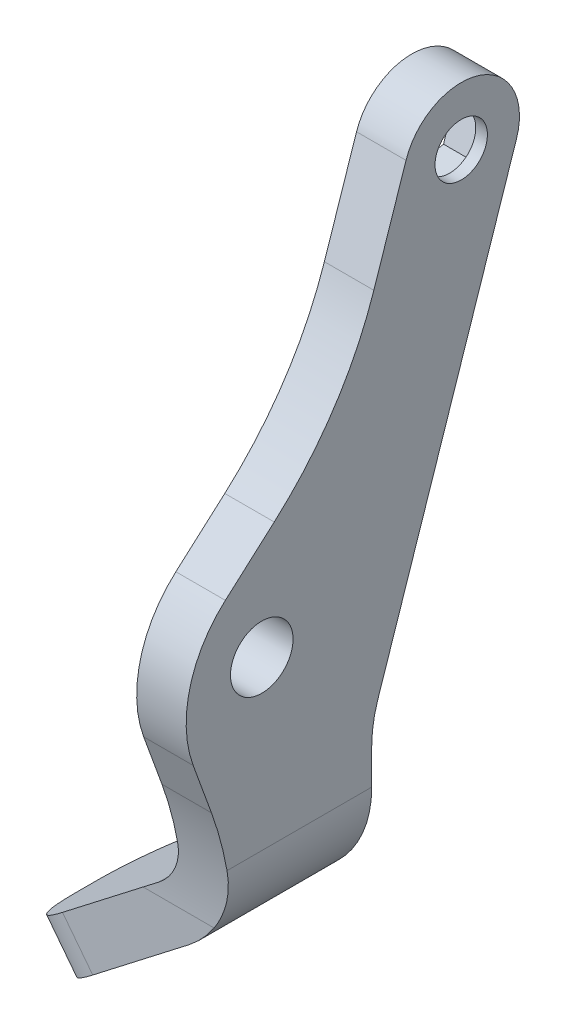
ISO-10303-21;
HEADER;
FILE_DESCRIPTION(('STEP AP214'),'2;1');
FILE_NAME('part.step','',(''),(''),'','','');
FILE_SCHEMA(('AUTOMOTIVE_DESIGN { 1 0 10303 214 1 1 1 1 }'));
ENDSEC;
DATA;
#1=APPLICATION_CONTEXT('core data for automotive mechanical design processes');
#2=APPLICATION_PROTOCOL_DEFINITION('international standard','automotive_design',2000,#1);
#3=PRODUCT_CONTEXT('',#1,'mechanical');
#4=PRODUCT('Part','Part','',(#3));
#5=PRODUCT_RELATED_PRODUCT_CATEGORY('part','',(#4));
#6=PRODUCT_DEFINITION_FORMATION('','',#4);
#7=PRODUCT_DEFINITION_CONTEXT('part definition',#1,'design');
#8=PRODUCT_DEFINITION('design','',#6,#7);
#9=PRODUCT_DEFINITION_SHAPE('','',#8);
#10=(LENGTH_UNIT() NAMED_UNIT(*) SI_UNIT(.MILLI.,.METRE.));
#11=(NAMED_UNIT(*) PLANE_ANGLE_UNIT() SI_UNIT($,.RADIAN.));
#12=(NAMED_UNIT(*) SI_UNIT($,.STERADIAN.) SOLID_ANGLE_UNIT());
#13=UNCERTAINTY_MEASURE_WITH_UNIT(LENGTH_MEASURE(1.E-05),#10,'distance_accuracy_value','');
#14=(GEOMETRIC_REPRESENTATION_CONTEXT(3) GLOBAL_UNCERTAINTY_ASSIGNED_CONTEXT((#13)) GLOBAL_UNIT_ASSIGNED_CONTEXT((#10,
#11,#12)) REPRESENTATION_CONTEXT('',''));
#15=CARTESIAN_POINT('',(0.,0.,0.));
#16=DIRECTION('',(0.,0.,1.));
#17=DIRECTION('',(1.,0.,0.));
#18=AXIS2_PLACEMENT_3D('',#15,#16,#17);
#19=CARTESIAN_POINT('',(15.8,-64.4,-62.432996066738));
#20=DIRECTION('',(0.,0.,1.));
#21=DIRECTION('',(1.,0.,0.));
#22=AXIS2_PLACEMENT_3D('',#19,#20,#21);
#23=PLANE('',#22);
#24=CARTESIAN_POINT('',(33.1,-64.3999999999998,-62.432996066738));
#25=DIRECTION('',(0.,0.,1.));
#26=DIRECTION('',(1.,0.,0.));
#27=AXIS2_PLACEMENT_3D('',#24,#25,#26);
#28=CIRCLE('',#27,7.7);
#29=CARTESIAN_POINT('',(37.8083729395756,-70.4927189547746,-62.432996066738));
#30=VERTEX_POINT('',#29);
#31=CARTESIAN_POINT('',(39.5328427948738,-68.6318475370031,-62.432996066738));
#32=VERTEX_POINT('',#31);
#33=EDGE_CURVE('E703',#30,#32,#28,.T.);
#34=ORIENTED_EDGE('',*,*,#33,.T.);
#35=DIRECTION('',(1.,0.,0.));
#36=VECTOR('',#35,1.);
#37=CARTESIAN_POINT('',(37.4,-68.6318475370031,-62.432996066738));
#38=LINE('',#37,#36);
#39=CARTESIAN_POINT('',(34.6560666904699,-68.6318475370031,-62.432996066738));
#40=VERTEX_POINT('',#39);
#41=EDGE_CURVE('E594',#32,#40,#38,.F.);
#42=ORIENTED_EDGE('',*,*,#41,.T.);
#43=DIRECTION('',(0.791262201918808,0.611477005139686,0.));
#44=VECTOR('',#43,1.);
#45=CARTESIAN_POINT('',(25.9538295509274,-75.3568217506062,-62.432996066738));
#46=LINE('',#45,#44);
#47=CARTESIAN_POINT('',(29.1188783586026,-72.9109137300475,-62.432996066738));
#48=VERTEX_POINT('',#47);
#49=EDGE_CURVE('E305',#48,#40,#46,.T.);
#50=ORIENTED_EDGE('',*,*,#49,.F.);
#51=DIRECTION('',(-0.611477005139684,0.79126220191881,0.));
#52=VECTOR('',#51,1.);
#53=CARTESIAN_POINT('',(31.1979001760775,-75.6012052165714,-62.432996066738));
#54=LINE('',#53,#52);
#55=CARTESIAN_POINT('',(31.1979001760775,-75.6012052165714,-62.432996066738));
#56=VERTEX_POINT('',#55);
#57=EDGE_CURVE('E677',#48,#56,#54,.F.);
#58=ORIENTED_EDGE('',*,*,#57,.T.);
#59=DIRECTION('',(-0.791262201918808,-0.611477005139686,0.));
#60=VECTOR('',#59,1.);
#61=CARTESIAN_POINT('',(37.8083729395754,-70.4927189547748,-62.432996066738));
#62=LINE('',#61,#60);
#63=EDGE_CURVE('E310',#30,#56,#62,.T.);
#64=ORIENTED_EDGE('',*,*,#63,.F.);
#65=EDGE_LOOP('',(#34,#42,#50,#58,#64));
#66=FACE_BOUND('',#65,.T.);
#67=ADVANCED_FACE('F51',(#66),#23,.T.);
#68=CARTESIAN_POINT('',(37.8083729395754,-70.4927189547748,-67.216498033369));
#69=DIRECTION('',(0.611477005139686,-0.791262201918808,0.));
#70=DIRECTION('',(0.,0.,-1.));
#71=AXIS2_PLACEMENT_3D('',#68,#69,#70);
#72=PLANE('',#71);
#73=DIRECTION('',(-0.791262201918808,-0.611477005139686,0.));
#74=VECTOR('',#73,1.);
#75=CARTESIAN_POINT('',(37.8083729395754,-70.4927189547748,-72.));
#76=LINE('',#75,#74);
#77=CARTESIAN_POINT('',(37.8083729395756,-70.4927189547746,-72.));
#78=VERTEX_POINT('',#77);
#79=CARTESIAN_POINT('',(31.1979001760775,-75.6012052165714,-72.));
#80=VERTEX_POINT('',#79);
#81=EDGE_CURVE('E343',#78,#80,#76,.T.);
#82=ORIENTED_EDGE('',*,*,#81,.F.);
#83=DIRECTION('',(0.,0.,1.));
#84=VECTOR('',#83,1.);
#85=CARTESIAN_POINT('',(37.8083729395756,-70.4927189547746,-67.216498033369));
#86=LINE('',#85,#84);
#87=EDGE_CURVE('E699',#78,#30,#86,.T.);
#88=ORIENTED_EDGE('',*,*,#87,.T.);
#89=ORIENTED_EDGE('',*,*,#63,.T.);
#90=CARTESIAN_POINT('',(31.1979001760775,-75.6012052165714,-66.432996066738));
#91=DIRECTION('',(0.611477005139686,-0.791262201918808,0.));
#92=DIRECTION('',(0.791262201918808,0.611477005139686,0.));
#93=AXIS2_PLACEMENT_3D('',#90,#91,#92);
#94=CIRCLE('',#93,4.);
#95=CARTESIAN_POINT('',(28.0328513684023,-78.0471132371301,-66.432996066738));
#96=VERTEX_POINT('',#95);
#97=EDGE_CURVE('E688',#56,#96,#94,.T.);
#98=ORIENTED_EDGE('',*,*,#97,.T.);
#99=DIRECTION('',(0.,0.,1.));
#100=VECTOR('',#99,1.);
#101=CARTESIAN_POINT('',(28.0328513684023,-78.0471132371301,-62.432996066738));
#102=LINE('',#101,#100);
#103=CARTESIAN_POINT('',(28.0328513684023,-78.0471132371301,-68.));
#104=VERTEX_POINT('',#103);
#105=EDGE_CURVE('E282',#104,#96,#102,.T.);
#106=ORIENTED_EDGE('',*,*,#105,.F.);
#107=CARTESIAN_POINT('',(31.1979001760775,-75.6012052165714,-68.));
#108=DIRECTION('',(0.611477005139686,-0.791262201918808,0.));
#109=DIRECTION('',(0.791262201918808,0.611477005139686,0.));
#110=AXIS2_PLACEMENT_3D('',#107,#108,#109);
#111=CIRCLE('',#110,4.);
#112=EDGE_CURVE('E684',#104,#80,#111,.T.);
#113=ORIENTED_EDGE('',*,*,#112,.T.);
#114=EDGE_LOOP('',(#82,#88,#89,#98,#106,#113));
#115=FACE_BOUND('',#114,.T.);
#116=ADVANCED_FACE('F639',(#115),#72,.T.);
#117=CARTESIAN_POINT('',(40.802,-64.9734332809365,-72.));
#118=DIRECTION('',(0.,0.,-1.));
#119=DIRECTION('',(0.,-1.,0.));
#120=AXIS2_PLACEMENT_3D('',#117,#118,#119);
#121=PLANE('',#120);
#122=DIRECTION('',(0.,1.,0.));
#123=VECTOR('',#122,1.);
#124=CARTESIAN_POINT('',(37.4,-64.9734332809365,-72.));
#125=LINE('',#124,#123);
#126=CARTESIAN_POINT('',(37.4,-64.3999999999999,-72.));
#127=VERTEX_POINT('',#126);
#128=CARTESIAN_POINT('',(37.4,-61.9468665618731,-72.));
#129=VERTEX_POINT('',#128);
#130=EDGE_CURVE('E309',#127,#129,#125,.T.);
#131=ORIENTED_EDGE('',*,*,#130,.T.);
#132=DIRECTION('',(1.,0.,0.));
#133=VECTOR('',#132,1.);
#134=CARTESIAN_POINT('',(40.8,-61.9468665618731,-72.));
#135=LINE('',#134,#133);
#136=CARTESIAN_POINT('',(40.8,-61.9468665618731,-72.));
#137=VERTEX_POINT('',#136);
#138=EDGE_CURVE('E560',#129,#137,#135,.T.);
#139=ORIENTED_EDGE('',*,*,#138,.T.);
#140=DIRECTION('',(0.,-1.,0.));
#141=VECTOR('',#140,1.);
#142=CARTESIAN_POINT('',(40.8,-64.9734332809365,-72.));
#143=LINE('',#142,#141);
#144=CARTESIAN_POINT('',(40.8,-64.3999999999998,-72.));
#145=VERTEX_POINT('',#144);
#146=EDGE_CURVE('E388',#137,#145,#143,.T.);
#147=ORIENTED_EDGE('',*,*,#146,.T.);
#148=CARTESIAN_POINT('',(33.1,-64.3999999999998,-72.));
#149=DIRECTION('',(0.,0.,-1.));
#150=DIRECTION('',(-1.,0.,0.));
#151=AXIS2_PLACEMENT_3D('',#148,#149,#150);
#152=CIRCLE('',#151,7.7);
#153=EDGE_CURVE('E710',#145,#78,#152,.T.);
#154=ORIENTED_EDGE('',*,*,#153,.T.);
#155=ORIENTED_EDGE('',*,*,#81,.T.);
#156=DIRECTION('',(0.611477005139684,-0.79126220191881,0.));
#157=VECTOR('',#156,1.);
#158=CARTESIAN_POINT('',(29.1188783586026,-72.9109137300475,-72.));
#159=LINE('',#158,#157);
#160=CARTESIAN_POINT('',(29.1188783586026,-72.9109137300475,-72.));
#161=VERTEX_POINT('',#160);
#162=EDGE_CURVE('E666',#80,#161,#159,.F.);
#163=ORIENTED_EDGE('',*,*,#162,.T.);
#164=DIRECTION('',(0.791262201918808,0.611477005139686,0.));
#165=VECTOR('',#164,1.);
#166=CARTESIAN_POINT('',(25.9538295509274,-75.3568217506062,-72.));
#167=LINE('',#166,#165);
#168=CARTESIAN_POINT('',(35.7293511221007,-67.8024274682508,-72.));
#169=VERTEX_POINT('',#168);
#170=EDGE_CURVE('E301',#161,#169,#167,.T.);
#171=ORIENTED_EDGE('',*,*,#170,.T.);
#172=CARTESIAN_POINT('',(33.1,-64.3999999999999,-72.));
#173=DIRECTION('',(0.,0.,-1.));
#174=DIRECTION('',(-1.,0.,0.));
#175=AXIS2_PLACEMENT_3D('',#172,#173,#174);
#176=CIRCLE('',#175,4.3);
#177=EDGE_CURVE('E562',#169,#127,#176,.F.);
#178=ORIENTED_EDGE('',*,*,#177,.T.);
#179=EDGE_LOOP('',(#131,#139,#147,#154,#155,#163,#171,#178));
#180=FACE_BOUND('',#179,.T.);
#181=ADVANCED_FACE('F559',(#180),#121,.T.);
#182=CARTESIAN_POINT('',(40.802,-34.6444235050632,-72.2334658327325));
#183=DIRECTION('',(0.,-0.316156072713349,-0.948707192808441));
#184=DIRECTION('',(0.,-0.948707192808441,0.316156072713349));
#185=AXIS2_PLACEMENT_3D('',#182,#183,#184);
#186=PLANE('',#185);
#187=DIRECTION('',(0.,0.948707192808441,-0.316156072713349));
#188=VECTOR('',#187,1.);
#189=CARTESIAN_POINT('',(37.4,-34.6444235050632,-72.2334658327325));
#190=LINE('',#189,#188);
#191=CARTESIAN_POINT('',(37.4,-34.9076169986524,-72.1457567672509));
#192=VERTEX_POINT('',#191);
#193=CARTESIAN_POINT('',(37.4,-28.2803021834753,-74.3543052429918));
#194=VERTEX_POINT('',#193);
#195=EDGE_CURVE('E488',#192,#194,#190,.T.);
#196=ORIENTED_EDGE('',*,*,#195,.F.);
#197=DIRECTION('',(-1.,0.,0.));
#198=VECTOR('',#197,1.);
#199=CARTESIAN_POINT('',(40.802,-34.9076169986524,-72.1457567672509));
#200=LINE('',#199,#198);
#201=CARTESIAN_POINT('',(40.8,-34.9076169986524,-72.1457567672509));
#202=VERTEX_POINT('',#201);
#203=EDGE_CURVE('E588',#192,#202,#200,.F.);
#204=ORIENTED_EDGE('',*,*,#203,.T.);
#205=DIRECTION('',(0.,-0.948707192808441,0.316156072713349));
#206=VECTOR('',#205,1.);
#207=CARTESIAN_POINT('',(40.8,-34.6444235050632,-72.2334658327325));
#208=LINE('',#207,#206);
#209=CARTESIAN_POINT('',(40.8,-28.2803021834753,-74.3543052429918));
#210=VERTEX_POINT('',#209);
#211=EDGE_CURVE('E407',#210,#202,#208,.T.);
#212=ORIENTED_EDGE('',*,*,#211,.F.);
#213=DIRECTION('',(-1.,0.,0.));
#214=VECTOR('',#213,1.);
#215=CARTESIAN_POINT('',(40.802,-28.2803021834753,-74.3543052429918));
#216=LINE('',#215,#214);
#217=EDGE_CURVE('E315',#210,#194,#216,.T.);
#218=ORIENTED_EDGE('',*,*,#217,.T.);
#219=EDGE_LOOP('',(#196,#204,#212,#218));
#220=FACE_BOUND('',#219,.T.);
#221=ADVANCED_FACE('F775',(#220),#186,.F.);
#222=CARTESIAN_POINT('',(40.802,-29.5449264743287,-78.1491340142255));
#223=DIRECTION('',(-1.,0.,0.));
#224=DIRECTION('',(0.,0.,1.));
#225=AXIS2_PLACEMENT_3D('',#222,#223,#224);
#226=CYLINDRICAL_SURFACE('',#225,4.);
#227=CARTESIAN_POINT('',(37.4,-29.5449264743287,-78.1491340142255));
#228=DIRECTION('',(-1.,0.,0.));
#229=DIRECTION('',(0.,0.,1.));
#230=AXIS2_PLACEMENT_3D('',#227,#228,#229);
#231=CIRCLE('',#230,4.);
#232=CARTESIAN_POINT('',(37.4,-30.8095507651821,-81.9439627854593));
#233=VERTEX_POINT('',#232);
#234=EDGE_CURVE('E484',#194,#233,#231,.T.);
#235=ORIENTED_EDGE('',*,*,#234,.F.);
#236=ORIENTED_EDGE('',*,*,#217,.F.);
#237=CARTESIAN_POINT('',(40.8,-29.5449264743287,-78.1491340142255));
#238=DIRECTION('',(1.,0.,0.));
#239=DIRECTION('',(0.,0.,-1.));
#240=AXIS2_PLACEMENT_3D('',#237,#238,#239);
#241=CIRCLE('',#240,4.);
#242=CARTESIAN_POINT('',(40.8,-30.8095507651821,-81.9439627854593));
#243=VERTEX_POINT('',#242);
#244=EDGE_CURVE('E400',#243,#210,#241,.T.);
#245=ORIENTED_EDGE('',*,*,#244,.F.);
#246=DIRECTION('',(-1.,0.,0.));
#247=VECTOR('',#246,1.);
#248=CARTESIAN_POINT('',(40.802,-30.8095507651821,-81.9439627854593));
#249=LINE('',#248,#247);
#250=EDGE_CURVE('E348',#243,#233,#249,.T.);
#251=ORIENTED_EDGE('',*,*,#250,.T.);
#252=EDGE_LOOP('',(#235,#236,#245,#251));
#253=FACE_BOUND('',#252,.T.);
#254=ADVANCED_FACE('F649',(#253),#226,.T.);
#255=CARTESIAN_POINT('',(40.802,-45.1135843726741,-77.1771526214959));
#256=DIRECTION('',(0.,-0.316156072713349,-0.948707192808441));
#257=DIRECTION('',(0.,-0.948707192808441,0.316156072713349));
#258=AXIS2_PLACEMENT_3D('',#255,#256,#257);
#259=PLANE('',#258);
#260=DIRECTION('',(0.,-0.948707192808441,0.316156072713349));
#261=VECTOR('',#260,1.);
#262=CARTESIAN_POINT('',(40.8,-45.1135843726741,-77.1771526214959));
#263=LINE('',#262,#261);
#264=CARTESIAN_POINT('',(40.8,-59.4176179801664,-72.4103424575325));
#265=VERTEX_POINT('',#264);
#266=EDGE_CURVE('E395',#243,#265,#263,.T.);
#267=ORIENTED_EDGE('',*,*,#266,.T.);
#268=DIRECTION('',(1.,0.,0.));
#269=VECTOR('',#268,1.);
#270=CARTESIAN_POINT('',(37.4,-59.4176179801664,-72.4103424575325));
#271=LINE('',#270,#269);
#272=CARTESIAN_POINT('',(37.4,-59.4176179801663,-72.4103424575325));
#273=VERTEX_POINT('',#272);
#274=EDGE_CURVE('E570',#265,#273,#271,.F.);
#275=ORIENTED_EDGE('',*,*,#274,.T.);
#276=DIRECTION('',(0.,0.94870719280844,-0.31615607271335));
#277=VECTOR('',#276,1.);
#278=CARTESIAN_POINT('',(37.4,-45.1135843726741,-77.1771526214959));
#279=LINE('',#278,#277);
#280=EDGE_CURVE('E352',#273,#233,#279,.T.);
#281=ORIENTED_EDGE('',*,*,#280,.T.);
#282=ORIENTED_EDGE('',*,*,#250,.F.);
#283=EDGE_LOOP('',(#267,#275,#281,#282));
#284=FACE_BOUND('',#283,.T.);
#285=ADVANCED_FACE('F746',(#284),#259,.T.);
#286=CARTESIAN_POINT('',(40.802,-43.2008771904526,-67.6406835772999));
#287=DIRECTION('',(0.,0.7481527869347,0.663526493368457));
#288=DIRECTION('',(1.,0.,0.));
#289=AXIS2_PLACEMENT_3D('',#286,#287,#288);
#290=PLANE('',#289);
#291=DIRECTION('',(0.,0.663526493368457,-0.7481527869347));
#292=VECTOR('',#291,1.);
#293=CARTESIAN_POINT('',(40.8,-43.2008771904526,-67.6406835772999));
#294=LINE('',#293,#292);
#295=CARTESIAN_POINT('',(40.8,-48.2560776774387,-61.9407418708998));
#296=VERTEX_POINT('',#295);
#297=CARTESIAN_POINT('',(40.8,-45.2755381399649,-65.3014199806913));
#298=VERTEX_POINT('',#297);
#299=EDGE_CURVE('E349',#296,#298,#294,.T.);
#300=ORIENTED_EDGE('',*,*,#299,.T.);
#301=DIRECTION('',(-1.,0.,0.));
#302=VECTOR('',#301,1.);
#303=CARTESIAN_POINT('',(40.802,-45.2755381399649,-65.3014199806913));
#304=LINE('',#303,#302);
#305=CARTESIAN_POINT('',(37.4,-45.2755381399649,-65.3014199806913));
#306=VERTEX_POINT('',#305);
#307=EDGE_CURVE('E585',#298,#306,#304,.T.);
#308=ORIENTED_EDGE('',*,*,#307,.T.);
#309=DIRECTION('',(0.,-0.663526493368457,0.7481527869347));
#310=VECTOR('',#309,1.);
#311=CARTESIAN_POINT('',(37.4,-43.2008771904526,-67.6406835772999));
#312=LINE('',#311,#310);
#313=CARTESIAN_POINT('',(37.4,-48.2560776774387,-61.9407418708998));
#314=VERTEX_POINT('',#313);
#315=EDGE_CURVE('E350',#306,#314,#312,.T.);
#316=ORIENTED_EDGE('',*,*,#315,.T.);
#317=DIRECTION('',(-1.,0.,0.));
#318=VECTOR('',#317,1.);
#319=CARTESIAN_POINT('',(40.802,-48.2560776774387,-61.9407418708998));
#320=LINE('',#319,#318);
#321=EDGE_CURVE('E577',#314,#296,#320,.F.);
#322=ORIENTED_EDGE('',*,*,#321,.T.);
#323=EDGE_LOOP('',(#300,#308,#316,#322));
#324=FACE_BOUND('',#323,.T.);
#325=ADVANCED_FACE('F721',(#324),#290,.T.);
#326=CARTESIAN_POINT('',(40.8,-23.2949264743284,-61.5917656593506));
#327=DIRECTION('',(1.,0.,0.));
#328=DIRECTION('',(0.,0.,1.));
#329=AXIS2_PLACEMENT_3D('',#326,#327,#328);
#330=PLANE('',#329);
#331=CARTESIAN_POINT('',(40.8,-52.8891770708178,-64.4445885354087));
#332=DIRECTION('',(-1.,0.,0.));
#333=DIRECTION('',(0.,0.,1.));
#334=AXIS2_PLACEMENT_3D('',#331,#332,#333);
#335=CIRCLE('',#334,2.15000000000001);
#336=CARTESIAN_POINT('',(40.8,-52.8891770708178,-62.2945885354087));
#337=VERTEX_POINT('',#336);
#338=EDGE_CURVE('E1095',#337,#337,#335,.T.);
#339=ORIENTED_EDGE('',*,*,#338,.T.);
#340=EDGE_LOOP('',(#339));
#341=FACE_BOUND('',#340,.T.);
#342=CARTESIAN_POINT('',(40.8,-29.5449264743287,-78.1491340142255));
#343=DIRECTION('',(-1.,0.,0.));
#344=DIRECTION('',(0.,0.,1.));
#345=AXIS2_PLACEMENT_3D('',#342,#343,#344);
#346=CIRCLE('',#345,1.80000000000001);
#347=CARTESIAN_POINT('',(40.8,-29.5449264743287,-76.3491340142255));
#348=VERTEX_POINT('',#347);
#349=EDGE_CURVE('E249',#348,#348,#346,.T.);
#350=ORIENTED_EDGE('',*,*,#349,.T.);
#351=EDGE_LOOP('',(#350));
#352=FACE_BOUND('',#351,.T.);
#353=ORIENTED_EDGE('',*,*,#299,.F.);
#354=CARTESIAN_POINT('',(40.8,-54.2412999729162,-67.2489538178474));
#355=DIRECTION('',(1.,0.,0.));
#356=DIRECTION('',(0.,0.,-1.));
#357=AXIS2_PLACEMENT_3D('',#354,#355,#356);
#358=CIRCLE('',#357,7.99999999999986);
#359=CARTESIAN_POINT('',(40.8,-56.9774611195215,-59.7314128515602));
#360=VERTEX_POINT('',#359);
#361=EDGE_CURVE('E571',#296,#360,#358,.T.);
#362=ORIENTED_EDGE('',*,*,#361,.T.);
#363=DIRECTION('',(0.,0.939692620785908,0.342020143325669));
#364=VECTOR('',#363,1.);
#365=CARTESIAN_POINT('',(40.8,-63.1727708464121,-61.9863211842083));
#366=LINE('',#365,#364);
#367=CARTESIAN_POINT('',(40.8,-60.4233640971871,-60.9856189655998));
#368=VERTEX_POINT('',#367);
#369=EDGE_CURVE('E384',#368,#360,#366,.T.);
#370=ORIENTED_EDGE('',*,*,#369,.F.);
#371=CARTESIAN_POINT('',(40.8,-68.6318475370031,-38.432996066738));
#372=DIRECTION('',(1.,0.,0.));
#373=DIRECTION('',(0.,0.,-1.));
#374=AXIS2_PLACEMENT_3D('',#371,#372,#373);
#375=CIRCLE('',#374,24.);
#376=CARTESIAN_POINT('',(40.8,-64.3999999999998,-62.0569556506765));
#377=VERTEX_POINT('',#376);
#378=EDGE_CURVE('E603',#368,#377,#375,.F.);
#379=ORIENTED_EDGE('',*,*,#378,.T.);
#380=DIRECTION('',(0.,0.,1.));
#381=VECTOR('',#380,1.);
#382=CARTESIAN_POINT('',(40.8,-64.3999999999998,-61.5917656593506));
#383=LINE('',#382,#381);
#384=EDGE_CURVE('E706',#377,#145,#383,.F.);
#385=ORIENTED_EDGE('',*,*,#384,.T.);
#386=ORIENTED_EDGE('',*,*,#146,.F.);
#387=CARTESIAN_POINT('',(40.8,-61.9468665618731,-79.9999999999998));
#388=DIRECTION('',(1.,0.,0.));
#389=DIRECTION('',(0.,0.,-1.));
#390=AXIS2_PLACEMENT_3D('',#387,#388,#389);
#391=CIRCLE('',#390,7.99999999999986);
#392=EDGE_CURVE('E568',#137,#265,#391,.F.);
#393=ORIENTED_EDGE('',*,*,#392,.T.);
#394=ORIENTED_EDGE('',*,*,#266,.F.);
#395=ORIENTED_EDGE('',*,*,#244,.T.);
#396=ORIENTED_EDGE('',*,*,#211,.T.);
#397=CARTESIAN_POINT('',(40.8,-27.3198712535321,-49.3767841398483));
#398=DIRECTION('',(1.,0.,0.));
#399=DIRECTION('',(0.,0.,-1.));
#400=AXIS2_PLACEMENT_3D('',#397,#398,#399);
#401=CIRCLE('',#400,24.);
#402=EDGE_CURVE('E600',#202,#298,#401,.F.);
#403=ORIENTED_EDGE('',*,*,#402,.T.);
#404=EDGE_LOOP('',(#353,#362,#370,#379,#385,#386,#393,#394,#395,#396,#403));
#405=FACE_BOUND('',#404,.T.);
#406=ADVANCED_FACE('F725',(#341,#352,#405),#330,.T.);
#407=CARTESIAN_POINT('',(40.802,-63.1727708464121,-61.9863211842083));
#408=DIRECTION('',(0.,-0.342020143325669,0.939692620785908));
#409=DIRECTION('',(-1.,0.,0.));
#410=AXIS2_PLACEMENT_3D('',#407,#408,#409);
#411=PLANE('',#410);
#412=DIRECTION('',(0.,-0.939692620785908,-0.342020143325669));
#413=VECTOR('',#412,1.);
#414=CARTESIAN_POINT('',(37.4,-63.1727708464121,-61.9863211842083));
#415=LINE('',#414,#413);
#416=CARTESIAN_POINT('',(37.4,-56.9774611195215,-59.7314128515602));
#417=VERTEX_POINT('',#416);
#418=CARTESIAN_POINT('',(37.4,-60.4233640971871,-60.9856189655998));
#419=VERTEX_POINT('',#418);
#420=EDGE_CURVE('E538',#417,#419,#415,.T.);
#421=ORIENTED_EDGE('',*,*,#420,.T.);
#422=DIRECTION('',(1.,0.,0.));
#423=VECTOR('',#422,1.);
#424=CARTESIAN_POINT('',(40.8,-60.4233640971871,-60.9856189655998));
#425=LINE('',#424,#423);
#426=EDGE_CURVE('E591',#419,#368,#425,.T.);
#427=ORIENTED_EDGE('',*,*,#426,.T.);
#428=ORIENTED_EDGE('',*,*,#369,.T.);
#429=DIRECTION('',(-1.,0.,0.));
#430=VECTOR('',#429,1.);
#431=CARTESIAN_POINT('',(40.802,-56.9774611195215,-59.7314128515602));
#432=LINE('',#431,#430);
#433=EDGE_CURVE('E713',#360,#417,#432,.T.);
#434=ORIENTED_EDGE('',*,*,#433,.T.);
#435=EDGE_LOOP('',(#421,#427,#428,#434));
#436=FACE_BOUND('',#435,.T.);
#437=ADVANCED_FACE('F728',(#436),#411,.T.);
#438=CARTESIAN_POINT('',(37.4,-48.7724632371643,-181.705350346033));
#439=DIRECTION('',(-1.,0.,0.));
#440=DIRECTION('',(0.,0.,1.));
#441=AXIS2_PLACEMENT_3D('',#438,#439,#440);
#442=PLANE('',#441);
#443=CARTESIAN_POINT('',(37.4,-52.8891770708178,-64.4445885354087));
#444=DIRECTION('',(-1.,0.,0.));
#445=DIRECTION('',(0.,0.,1.));
#446=AXIS2_PLACEMENT_3D('',#443,#444,#445);
#447=CIRCLE('',#446,2.15000000000001);
#448=CARTESIAN_POINT('',(37.4,-52.8891770708178,-62.2945885354087));
#449=VERTEX_POINT('',#448);
#450=EDGE_CURVE('E1098',#449,#449,#447,.T.);
#451=ORIENTED_EDGE('',*,*,#450,.F.);
#452=EDGE_LOOP('',(#451));
#453=FACE_BOUND('',#452,.T.);
#454=DIRECTION('',(0.,0.948707192808439,-0.316156072713355));
#455=VECTOR('',#454,1.);
#456=CARTESIAN_POINT('',(37.4,-30.2049302735733,-74.9251000527136));
#457=LINE('',#456,#455);
#458=CARTESIAN_POINT('',(37.4,-30.2049302735733,-74.9251000527136));
#459=VERTEX_POINT('',#458);
#460=CARTESIAN_POINT('',(37.4,-27.0828330606179,-75.9655369767294));
#461=VERTEX_POINT('',#460);
#462=EDGE_CURVE('E221',#459,#461,#457,.T.);
#463=ORIENTED_EDGE('',*,*,#462,.F.);
#464=DIRECTION('',(0.,0.748152786934705,0.663526493368451));
#465=VECTOR('',#464,1.);
#466=CARTESIAN_POINT('',(37.4,-32.6670236872841,-77.1086970902097));
#467=LINE('',#466,#465);
#468=CARTESIAN_POINT('',(37.4,-32.6670236872841,-77.1086970902097));
#469=VERTEX_POINT('',#468);
#470=EDGE_CURVE('E242',#469,#459,#467,.T.);
#471=ORIENTED_EDGE('',*,*,#470,.F.);
#472=DIRECTION('',(0.,-0.200554405873706,0.979682566081812));
#473=VECTOR('',#472,1.);
#474=CARTESIAN_POINT('',(37.4,-32.0070198880395,-80.3327310517217));
#475=LINE('',#474,#473);
#476=CARTESIAN_POINT('',(37.4,-32.0070198880395,-80.3327310517217));
#477=VERTEX_POINT('',#476);
#478=EDGE_CURVE('E246',#477,#469,#475,.T.);
#479=ORIENTED_EDGE('',*,*,#478,.F.);
#480=DIRECTION('',(0.,-0.948707192808443,0.316156072713342));
#481=VECTOR('',#480,1.);
#482=CARTESIAN_POINT('',(37.4,-28.884922675084,-81.3731679757375));
#483=LINE('',#482,#481);
#484=CARTESIAN_POINT('',(37.4,-28.884922675084,-81.3731679757375));
#485=VERTEX_POINT('',#484);
#486=EDGE_CURVE('E272',#485,#477,#483,.T.);
#487=ORIENTED_EDGE('',*,*,#486,.F.);
#488=DIRECTION('',(0.,-0.748152786934693,-0.663526493368464));
#489=VECTOR('',#488,1.);
#490=CARTESIAN_POINT('',(37.4,-26.4228292613732,-79.1895709382413));
#491=LINE('',#490,#489);
#492=CARTESIAN_POINT('',(37.4,-26.4228292613732,-79.1895709382413));
#493=VERTEX_POINT('',#492);
#494=EDGE_CURVE('E268',#493,#485,#491,.T.);
#495=ORIENTED_EDGE('',*,*,#494,.F.);
#496=DIRECTION('',(0.,0.200554405873742,-0.979682566081805));
#497=VECTOR('',#496,1.);
#498=CARTESIAN_POINT('',(37.4,-27.0828330606179,-75.9655369767294));
#499=LINE('',#498,#497);
#500=EDGE_CURVE('E265',#461,#493,#499,.T.);
#501=ORIENTED_EDGE('',*,*,#500,.F.);
#502=EDGE_LOOP('',(#463,#471,#479,#487,#495,#501));
#503=FACE_BOUND('',#502,.T.);
#504=ORIENTED_EDGE('',*,*,#420,.F.);
#505=CARTESIAN_POINT('',(37.4,-54.2412999729162,-67.2489538178474));
#506=DIRECTION('',(-1.,0.,0.));
#507=DIRECTION('',(0.,0.,1.));
#508=AXIS2_PLACEMENT_3D('',#505,#506,#507);
#509=CIRCLE('',#508,7.99999999999986);
#510=EDGE_CURVE('E716',#417,#314,#509,.T.);
#511=ORIENTED_EDGE('',*,*,#510,.T.);
#512=ORIENTED_EDGE('',*,*,#315,.F.);
#513=CARTESIAN_POINT('',(37.4,-27.3198712535321,-49.3767841398483));
#514=DIRECTION('',(-1.,0.,0.));
#515=DIRECTION('',(0.,0.,1.));
#516=AXIS2_PLACEMENT_3D('',#513,#514,#515);
#517=CIRCLE('',#516,24.);
#518=EDGE_CURVE('E597',#306,#192,#517,.F.);
#519=ORIENTED_EDGE('',*,*,#518,.T.);
#520=ORIENTED_EDGE('',*,*,#195,.T.);
#521=ORIENTED_EDGE('',*,*,#234,.T.);
#522=ORIENTED_EDGE('',*,*,#280,.F.);
#523=CARTESIAN_POINT('',(37.4,-61.9468665618731,-79.9999999999998));
#524=DIRECTION('',(-1.,0.,0.));
#525=DIRECTION('',(0.,0.,1.));
#526=AXIS2_PLACEMENT_3D('',#523,#524,#525);
#527=CIRCLE('',#526,7.99999999999986);
#528=EDGE_CURVE('E567',#273,#129,#527,.F.);
#529=ORIENTED_EDGE('',*,*,#528,.T.);
#530=ORIENTED_EDGE('',*,*,#130,.F.);
#531=DIRECTION('',(0.,0.,-1.));
#532=VECTOR('',#531,1.);
#533=CARTESIAN_POINT('',(37.4,-64.3999999999999,-181.705350346033));
#534=LINE('',#533,#532);
#535=CARTESIAN_POINT('',(37.4,-64.3999999999999,-62.0569556506765));
#536=VERTEX_POINT('',#535);
#537=EDGE_CURVE('E67',#127,#536,#534,.F.);
#538=ORIENTED_EDGE('',*,*,#537,.T.);
#539=CARTESIAN_POINT('',(37.4,-68.6318475370031,-38.432996066738));
#540=DIRECTION('',(-1.,0.,0.));
#541=DIRECTION('',(0.,0.,1.));
#542=AXIS2_PLACEMENT_3D('',#539,#540,#541);
#543=CIRCLE('',#542,24.);
#544=EDGE_CURVE('E12',#536,#419,#543,.F.);
#545=ORIENTED_EDGE('',*,*,#544,.T.);
#546=EDGE_LOOP('',(#504,#511,#512,#519,#520,#521,#522,#529,#530,#538,#545));
#547=FACE_BOUND('',#546,.T.);
#548=ADVANCED_FACE('F729',(#453,#503,#547),#442,.T.);
#549=CARTESIAN_POINT('',(25.9538295509274,-75.3568217506062,-72.));
#550=DIRECTION('',(0.611477005139686,-0.791262201918808,0.));
#551=DIRECTION('',(0.791262201918808,0.611477005139686,0.));
#552=AXIS2_PLACEMENT_3D('',#549,#550,#551);
#553=PLANE('',#552);
#554=ORIENTED_EDGE('',*,*,#49,.T.);
#555=CARTESIAN_POINT('',(34.6560666904699,-68.6318475370031,-38.432996066738));
#556=DIRECTION('',(0.611477005139686,-0.791262201918808,0.));
#557=DIRECTION('',(-0.791262201918808,-0.611477005139686,0.));
#558=AXIS2_PLACEMENT_3D('',#555,#556,#557);
#559=ELLIPSE('',#558,39.249227359772,24.);
#560=CARTESIAN_POINT('',(35.7293511221007,-67.8024274682508,-62.4186597504794));
#561=VERTEX_POINT('',#560);
#562=EDGE_CURVE('E615',#40,#561,#559,.T.);
#563=ORIENTED_EDGE('',*,*,#562,.T.);
#564=DIRECTION('',(0.,0.,-1.));
#565=VECTOR('',#564,1.);
#566=CARTESIAN_POINT('',(35.7293511221007,-67.8024274682508,-72.));
#567=LINE('',#566,#565);
#568=EDGE_CURVE('E74',#561,#169,#567,.T.);
#569=ORIENTED_EDGE('',*,*,#568,.T.);
#570=ORIENTED_EDGE('',*,*,#170,.F.);
#571=CARTESIAN_POINT('',(29.1188783586026,-72.9109137300475,-68.));
#572=DIRECTION('',(0.611477005139686,-0.791262201918808,0.));
#573=DIRECTION('',(0.791262201918808,0.611477005139686,0.));
#574=AXIS2_PLACEMENT_3D('',#571,#572,#573);
#575=CIRCLE('',#574,4.);
#576=CARTESIAN_POINT('',(25.9538295509274,-75.3568217506062,-68.));
#577=VERTEX_POINT('',#576);
#578=EDGE_CURVE('E665',#161,#577,#575,.F.);
#579=ORIENTED_EDGE('',*,*,#578,.T.);
#580=DIRECTION('',(0.,0.,-1.));
#581=VECTOR('',#580,1.);
#582=CARTESIAN_POINT('',(25.9538295509274,-75.3568217506062,-72.));
#583=LINE('',#582,#581);
#584=CARTESIAN_POINT('',(25.9538295509274,-75.3568217506062,-66.432996066738));
#585=VERTEX_POINT('',#584);
#586=EDGE_CURVE('E297',#585,#577,#583,.T.);
#587=ORIENTED_EDGE('',*,*,#586,.F.);
#588=CARTESIAN_POINT('',(29.1188783586026,-72.9109137300475,-66.432996066738));
#589=DIRECTION('',(0.611477005139686,-0.791262201918808,0.));
#590=DIRECTION('',(0.791262201918808,0.611477005139686,0.));
#591=AXIS2_PLACEMENT_3D('',#588,#589,#590);
#592=CIRCLE('',#591,4.);
#593=EDGE_CURVE('E672',#585,#48,#592,.F.);
#594=ORIENTED_EDGE('',*,*,#593,.T.);
#595=EDGE_LOOP('',(#554,#563,#569,#570,#579,#587,#594));
#596=FACE_BOUND('',#595,.T.);
#597=ADVANCED_FACE('F809',(#596),#553,.F.);
#598=CARTESIAN_POINT('',(-20.2109567150511,-15.6187610796495,0.));
#599=DIRECTION('',(0.79126220191881,0.611477005139684,0.));
#600=DIRECTION('',(-0.611477005139684,0.79126220191881,0.));
#601=AXIS2_PLACEMENT_3D('',#598,#599,#600);
#602=PLANE('',#601);
#603=ORIENTED_EDGE('',*,*,#105,.T.);
#604=DIRECTION('',(-0.611477005139684,0.79126220191881,0.));
#605=VECTOR('',#604,1.);
#606=CARTESIAN_POINT('',(25.9538295509274,-75.3568217506062,-66.432996066738));
#607=LINE('',#606,#605);
#608=EDGE_CURVE('E673',#96,#585,#607,.T.);
#609=ORIENTED_EDGE('',*,*,#608,.T.);
#610=ORIENTED_EDGE('',*,*,#586,.T.);
#611=DIRECTION('',(0.611477005139684,-0.79126220191881,0.));
#612=VECTOR('',#611,1.);
#613=CARTESIAN_POINT('',(28.0328513684023,-78.0471132371301,-68.));
#614=LINE('',#613,#612);
#615=EDGE_CURVE('E314',#577,#104,#614,.T.);
#616=ORIENTED_EDGE('',*,*,#615,.T.);
#617=EDGE_LOOP('',(#603,#609,#610,#616));
#618=FACE_BOUND('',#617,.T.);
#619=ADVANCED_FACE('F893',(#618),#602,.F.);
#620=CARTESIAN_POINT('',(40.,-30.2049302735733,-74.9251000527136));
#621=DIRECTION('',(0.,0.316156072713355,0.948707192808439));
#622=DIRECTION('',(0.,-0.948707192808439,0.316156072713355));
#623=AXIS2_PLACEMENT_3D('',#620,#621,#622);
#624=PLANE('',#623);
#625=ORIENTED_EDGE('',*,*,#462,.T.);
#626=DIRECTION('',(-1.,0.,0.));
#627=VECTOR('',#626,1.);
#628=CARTESIAN_POINT('',(40.,-27.0828330606179,-75.9655369767294));
#629=LINE('',#628,#627);
#630=CARTESIAN_POINT('',(40.,-27.0828330606179,-75.9655369767294));
#631=VERTEX_POINT('',#630);
#632=EDGE_CURVE('E214',#631,#461,#629,.T.);
#633=ORIENTED_EDGE('',*,*,#632,.F.);
#634=DIRECTION('',(0.,0.948707192808439,-0.316156072713355));
#635=VECTOR('',#634,1.);
#636=CARTESIAN_POINT('',(40.,-30.2049302735733,-74.9251000527136));
#637=LINE('',#636,#635);
#638=CARTESIAN_POINT('',(40.,-30.2049302735733,-74.9251000527136));
#639=VERTEX_POINT('',#638);
#640=EDGE_CURVE('E218',#639,#631,#637,.T.);
#641=ORIENTED_EDGE('',*,*,#640,.F.);
#642=DIRECTION('',(-1.,0.,0.));
#643=VECTOR('',#642,1.);
#644=CARTESIAN_POINT('',(40.,-30.2049302735733,-74.9251000527136));
#645=LINE('',#644,#643);
#646=EDGE_CURVE('E279',#639,#459,#645,.T.);
#647=ORIENTED_EDGE('',*,*,#646,.T.);
#648=EDGE_LOOP('',(#625,#633,#641,#647));
#649=FACE_BOUND('',#648,.T.);
#650=ADVANCED_FACE('F216',(#649),#624,.F.);
#651=CARTESIAN_POINT('',(40.,-32.6670236872841,-77.1086970902097));
#652=DIRECTION('',(0.,-0.663526493368451,0.748152786934705));
#653=DIRECTION('',(0.,-0.748152786934705,-0.663526493368451));
#654=AXIS2_PLACEMENT_3D('',#651,#652,#653);
#655=PLANE('',#654);
#656=ORIENTED_EDGE('',*,*,#470,.T.);
#657=ORIENTED_EDGE('',*,*,#646,.F.);
#658=DIRECTION('',(0.,0.748152786934705,0.663526493368451));
#659=VECTOR('',#658,1.);
#660=CARTESIAN_POINT('',(40.,-32.6670236872841,-77.1086970902097));
#661=LINE('',#660,#659);
#662=CARTESIAN_POINT('',(40.,-32.6670236872841,-77.1086970902097));
#663=VERTEX_POINT('',#662);
#664=EDGE_CURVE('E227',#663,#639,#661,.T.);
#665=ORIENTED_EDGE('',*,*,#664,.F.);
#666=DIRECTION('',(-1.,0.,0.));
#667=VECTOR('',#666,1.);
#668=CARTESIAN_POINT('',(40.,-32.6670236872841,-77.1086970902097));
#669=LINE('',#668,#667);
#670=EDGE_CURVE('E283',#663,#469,#669,.T.);
#671=ORIENTED_EDGE('',*,*,#670,.T.);
#672=EDGE_LOOP('',(#656,#657,#665,#671));
#673=FACE_BOUND('',#672,.T.);
#674=ADVANCED_FACE('F911',(#673),#655,.F.);
#675=CARTESIAN_POINT('',(40.,-32.0070198880395,-80.3327310517217));
#676=DIRECTION('',(0.,-0.979682566081812,-0.200554405873706));
#677=DIRECTION('',(0.,0.200554405873706,-0.979682566081812));
#678=AXIS2_PLACEMENT_3D('',#675,#676,#677);
#679=PLANE('',#678);
#680=ORIENTED_EDGE('',*,*,#478,.T.);
#681=ORIENTED_EDGE('',*,*,#670,.F.);
#682=DIRECTION('',(0.,-0.200554405873706,0.979682566081812));
#683=VECTOR('',#682,1.);
#684=CARTESIAN_POINT('',(40.,-32.0070198880395,-80.3327310517217));
#685=LINE('',#684,#683);
#686=CARTESIAN_POINT('',(40.,-32.0070198880395,-80.3327310517217));
#687=VERTEX_POINT('',#686);
#688=EDGE_CURVE('E258',#687,#663,#685,.T.);
#689=ORIENTED_EDGE('',*,*,#688,.F.);
#690=DIRECTION('',(-1.,0.,0.));
#691=VECTOR('',#690,1.);
#692=CARTESIAN_POINT('',(40.,-32.0070198880395,-80.3327310517217));
#693=LINE('',#692,#691);
#694=EDGE_CURVE('E286',#687,#477,#693,.T.);
#695=ORIENTED_EDGE('',*,*,#694,.T.);
#696=EDGE_LOOP('',(#680,#681,#689,#695));
#697=FACE_BOUND('',#696,.T.);
#698=ADVANCED_FACE('F919',(#697),#679,.F.);
#699=CARTESIAN_POINT('',(40.,-28.884922675084,-81.3731679757375));
#700=DIRECTION('',(0.,-0.316156072713342,-0.948707192808443));
#701=DIRECTION('',(0.,0.948707192808443,-0.316156072713342));
#702=AXIS2_PLACEMENT_3D('',#699,#700,#701);
#703=PLANE('',#702);
#704=ORIENTED_EDGE('',*,*,#486,.T.);
#705=ORIENTED_EDGE('',*,*,#694,.F.);
#706=DIRECTION('',(0.,-0.948707192808443,0.316156072713342));
#707=VECTOR('',#706,1.);
#708=CARTESIAN_POINT('',(40.,-28.884922675084,-81.3731679757375));
#709=LINE('',#708,#707);
#710=CARTESIAN_POINT('',(40.,-28.884922675084,-81.3731679757375));
#711=VERTEX_POINT('',#710);
#712=EDGE_CURVE('E254',#711,#687,#709,.T.);
#713=ORIENTED_EDGE('',*,*,#712,.F.);
#714=DIRECTION('',(-1.,0.,0.));
#715=VECTOR('',#714,1.);
#716=CARTESIAN_POINT('',(40.,-28.884922675084,-81.3731679757375));
#717=LINE('',#716,#715);
#718=EDGE_CURVE('E289',#711,#485,#717,.T.);
#719=ORIENTED_EDGE('',*,*,#718,.T.);
#720=EDGE_LOOP('',(#704,#705,#713,#719));
#721=FACE_BOUND('',#720,.T.);
#722=ADVANCED_FACE('F929',(#721),#703,.F.);
#723=CARTESIAN_POINT('',(40.,-26.4228292613732,-79.1895709382413));
#724=DIRECTION('',(0.,0.663526493368465,-0.748152786934693));
#725=DIRECTION('',(0.,0.748152786934694,0.663526493368465));
#726=AXIS2_PLACEMENT_3D('',#723,#724,#725);
#727=PLANE('',#726);
#728=ORIENTED_EDGE('',*,*,#494,.T.);
#729=ORIENTED_EDGE('',*,*,#718,.F.);
#730=DIRECTION('',(0.,-0.748152786934693,-0.663526493368464));
#731=VECTOR('',#730,1.);
#732=CARTESIAN_POINT('',(40.,-26.4228292613732,-79.1895709382413));
#733=LINE('',#732,#731);
#734=CARTESIAN_POINT('',(40.,-26.4228292613732,-79.1895709382413));
#735=VERTEX_POINT('',#734);
#736=EDGE_CURVE('E236',#735,#711,#733,.T.);
#737=ORIENTED_EDGE('',*,*,#736,.F.);
#738=DIRECTION('',(-1.,0.,0.));
#739=VECTOR('',#738,1.);
#740=CARTESIAN_POINT('',(40.,-26.4228292613732,-79.1895709382413));
#741=LINE('',#740,#739);
#742=EDGE_CURVE('E226',#735,#493,#741,.T.);
#743=ORIENTED_EDGE('',*,*,#742,.T.);
#744=EDGE_LOOP('',(#728,#729,#737,#743));
#745=FACE_BOUND('',#744,.T.);
#746=ADVANCED_FACE('F939',(#745),#727,.F.);
#747=CARTESIAN_POINT('',(40.,-27.0828330606179,-75.9655369767294));
#748=DIRECTION('',(0.,0.979682566081805,0.200554405873742));
#749=DIRECTION('',(0.,-0.200554405873742,0.979682566081805));
#750=AXIS2_PLACEMENT_3D('',#747,#748,#749);
#751=PLANE('',#750);
#752=ORIENTED_EDGE('',*,*,#500,.T.);
#753=ORIENTED_EDGE('',*,*,#742,.F.);
#754=DIRECTION('',(0.,0.200554405873742,-0.979682566081805));
#755=VECTOR('',#754,1.);
#756=CARTESIAN_POINT('',(40.,-27.0828330606179,-75.9655369767294));
#757=LINE('',#756,#755);
#758=EDGE_CURVE('E230',#631,#735,#757,.T.);
#759=ORIENTED_EDGE('',*,*,#758,.F.);
#760=ORIENTED_EDGE('',*,*,#632,.T.);
#761=EDGE_LOOP('',(#752,#753,#759,#760));
#762=FACE_BOUND('',#761,.T.);
#763=ADVANCED_FACE('F231',(#762),#751,.F.);
#764=CARTESIAN_POINT('',(40.,0.,0.));
#765=DIRECTION('',(-1.,0.,0.));
#766=DIRECTION('',(0.,0.,1.));
#767=AXIS2_PLACEMENT_3D('',#764,#765,#766);
#768=PLANE('',#767);
#769=CARTESIAN_POINT('',(40.,-29.5449264743287,-78.1491340142255));
#770=DIRECTION('',(-1.,0.,0.));
#771=DIRECTION('',(0.,0.,1.));
#772=AXIS2_PLACEMENT_3D('',#769,#770,#771);
#773=CIRCLE('',#772,1.80000000000001);
#774=CARTESIAN_POINT('',(40.,-29.5449264743287,-76.3491340142255));
#775=VERTEX_POINT('',#774);
#776=EDGE_CURVE('E1102',#775,#775,#773,.T.);
#777=ORIENTED_EDGE('',*,*,#776,.F.);
#778=EDGE_LOOP('',(#777));
#779=FACE_BOUND('',#778,.T.);
#780=ORIENTED_EDGE('',*,*,#640,.T.);
#781=ORIENTED_EDGE('',*,*,#758,.T.);
#782=ORIENTED_EDGE('',*,*,#736,.T.);
#783=ORIENTED_EDGE('',*,*,#712,.T.);
#784=ORIENTED_EDGE('',*,*,#688,.T.);
#785=ORIENTED_EDGE('',*,*,#664,.T.);
#786=EDGE_LOOP('',(#780,#781,#782,#783,#784,#785));
#787=FACE_BOUND('',#786,.T.);
#788=ADVANCED_FACE('F238',(#779,#787),#768,.T.);
#789=CARTESIAN_POINT('',(40.,-29.5449264743287,-78.1491340142255));
#790=DIRECTION('',(-1.,0.,0.));
#791=DIRECTION('',(0.,0.,1.));
#792=AXIS2_PLACEMENT_3D('',#789,#790,#791);
#793=CYLINDRICAL_SURFACE('',#792,1.80000000000001);
#794=ORIENTED_EDGE('',*,*,#349,.F.);
#795=EDGE_LOOP('',(#794));
#796=FACE_BOUND('',#795,.T.);
#797=ORIENTED_EDGE('',*,*,#776,.T.);
#798=EDGE_LOOP('',(#797));
#799=FACE_BOUND('',#798,.T.);
#800=ADVANCED_FACE('F966',(#796,#799),#793,.F.);
#801=CARTESIAN_POINT('',(37.4,-52.8891770708178,-64.4445885354087));
#802=DIRECTION('',(-1.,0.,0.));
#803=DIRECTION('',(0.,0.,1.));
#804=AXIS2_PLACEMENT_3D('',#801,#802,#803);
#805=CYLINDRICAL_SURFACE('',#804,2.15000000000001);
#806=ORIENTED_EDGE('',*,*,#338,.F.);
#807=EDGE_LOOP('',(#806));
#808=FACE_BOUND('',#807,.T.);
#809=ORIENTED_EDGE('',*,*,#450,.T.);
#810=EDGE_LOOP('',(#809));
#811=FACE_BOUND('',#810,.T.);
#812=ADVANCED_FACE('F655',(#808,#811),#805,.F.);
#813=CARTESIAN_POINT('',(-17.0459079073759,-13.1728530590908,-66.432996066738));
#814=DIRECTION('',(0.611477005139684,-0.79126220191881,0.));
#815=DIRECTION('',(0.79126220191881,0.611477005139684,0.));
#816=AXIS2_PLACEMENT_3D('',#813,#814,#815);
#817=CYLINDRICAL_SURFACE('',#816,4.);
#818=ORIENTED_EDGE('',*,*,#97,.F.);
#819=ORIENTED_EDGE('',*,*,#57,.F.);
#820=ORIENTED_EDGE('',*,*,#593,.F.);
#821=ORIENTED_EDGE('',*,*,#608,.F.);
#822=EDGE_LOOP('',(#818,#819,#820,#821));
#823=FACE_BOUND('',#822,.T.);
#824=ADVANCED_FACE('F652',(#823),#817,.T.);
#825=CARTESIAN_POINT('',(-17.0459079073759,-13.1728530590908,-68.));
#826=DIRECTION('',(-0.611477005139684,0.79126220191881,0.));
#827=DIRECTION('',(-0.79126220191881,-0.611477005139684,0.));
#828=AXIS2_PLACEMENT_3D('',#825,#826,#827);
#829=CYLINDRICAL_SURFACE('',#828,4.);
#830=ORIENTED_EDGE('',*,*,#578,.F.);
#831=ORIENTED_EDGE('',*,*,#162,.F.);
#832=ORIENTED_EDGE('',*,*,#112,.F.);
#833=ORIENTED_EDGE('',*,*,#615,.F.);
#834=EDGE_LOOP('',(#830,#831,#832,#833));
#835=FACE_BOUND('',#834,.T.);
#836=ADVANCED_FACE('F654',(#835),#829,.T.);
#837=CARTESIAN_POINT('',(33.1,-64.3999999999999,-72.));
#838=DIRECTION('',(0.,0.,-1.));
#839=DIRECTION('',(-1.,0.,0.));
#840=AXIS2_PLACEMENT_3D('',#837,#838,#839);
#841=CYLINDRICAL_SURFACE('',#840,4.3);
#842=ORIENTED_EDGE('',*,*,#568,.F.);
#843=CARTESIAN_POINT('',(35.7293511221007,-67.8024274682508,-62.4186597504794));
#844=CARTESIAN_POINT('',(35.8243229365256,-67.7290517766631,-62.4161229300634));
#845=CARTESIAN_POINT('',(35.9161977432637,-67.6516855720478,-62.4131101861058));
#846=CARTESIAN_POINT('',(36.0931402017659,-67.4895755518139,-62.4059347610204));
#847=CARTESIAN_POINT('',(36.1782079139119,-67.4048318016514,-62.4017720900944));
#848=CARTESIAN_POINT('',(36.3408322771149,-67.2286689538165,-62.3921041804821));
#849=CARTESIAN_POINT('',(36.4183973554688,-67.1372575529342,-62.3866004731581));
#850=CARTESIAN_POINT('',(36.5655804019208,-66.9483498660313,-62.374065256235));
#851=CARTESIAN_POINT('',(36.6351986663191,-66.8508538070895,-62.367033803627));
#852=CARTESIAN_POINT('',(36.7660574683696,-66.6504130531586,-62.3512741979261));
#853=CARTESIAN_POINT('',(36.8272914416095,-66.5474641753958,-62.3425447281818));
#854=CARTESIAN_POINT('',(36.9409235000033,-66.3369112482335,-62.3232545116247));
#855=CARTESIAN_POINT('',(36.993317947792,-66.2293053052779,-62.3126930145611));
#856=CARTESIAN_POINT('',(37.0888556191017,-66.0103661732555,-62.2896499109075));
#857=CARTESIAN_POINT('',(37.1320067857591,-65.8990362802395,-62.2771699688891));
#858=CARTESIAN_POINT('',(37.2088566365993,-65.6733891463057,-62.2502263592895));
#859=CARTESIAN_POINT('',(37.2425531072343,-65.5590712126601,-62.2357622283453));
#860=CARTESIAN_POINT('',(37.3142247729792,-65.2725589725918,-62.1973575114584));
#861=CARTESIAN_POINT('',(37.346431792341,-65.0990308058328,-62.1722099592646));
#862=CARTESIAN_POINT('',(37.3785954242295,-64.837448274335,-62.1313159445186));
#863=CARTESIAN_POINT('',(37.3866254888115,-64.7500465895924,-62.1171571733813));
#864=CARTESIAN_POINT('',(37.3973273246781,-64.5750763424378,-62.0878154344061));
#865=CARTESIAN_POINT('',(37.3999984707496,-64.4875077617472,-62.0726323472772));
#866=CARTESIAN_POINT('',(37.4,-64.3999999999999,-62.0569556506765));
#867=B_SPLINE_CURVE_WITH_KNOTS('',3,(#843,#844,#845,#846,#847,#848,#849,#850,#851,#852,#853,
#854,#855,#856,#857,#858,#859,#860,#861,#862,#863,#864,#865,#866),.UNSPECIFIED.,.F.,.F.,(4,2,2,
2,2,2,2,2,2,2,2,4),(0.,0.360018884818668,0.720034575747751,1.07964106690874,1.43923414560636,
1.79910717424624,2.15912792730471,2.51883804723487,2.87863231290409,3.41187320744631,
3.67844800571639,3.94505390287053),.UNSPECIFIED.);
#868=EDGE_CURVE('E61',#561,#536,#867,.T.);
#869=ORIENTED_EDGE('',*,*,#868,.T.);
#870=ORIENTED_EDGE('',*,*,#537,.F.);
#871=ORIENTED_EDGE('',*,*,#177,.F.);
#872=EDGE_LOOP('',(#842,#869,#870,#871));
#873=FACE_BOUND('',#872,.T.);
#874=ADVANCED_FACE('F622',(#873),#841,.F.);
#875=CARTESIAN_POINT('',(33.1,-64.3999999999998,-67.216498033369));
#876=DIRECTION('',(0.,0.,1.));
#877=DIRECTION('',(1.,0.,0.));
#878=AXIS2_PLACEMENT_3D('',#875,#876,#877);
#879=CYLINDRICAL_SURFACE('',#878,7.7);
#880=ORIENTED_EDGE('',*,*,#153,.F.);
#881=ORIENTED_EDGE('',*,*,#384,.F.);
#882=CARTESIAN_POINT('',(40.8,-64.3999999999998,-62.0569556506765));
#883=CARTESIAN_POINT('',(40.8000300037985,-64.6083287531336,-62.094302253006));
#884=CARTESIAN_POINT('',(40.7915463041537,-64.8171754753306,-62.1288425968727));
#885=CARTESIAN_POINT('',(40.7575130097852,-65.2343748197248,-62.1922332218562));
#886=CARTESIAN_POINT('',(40.7319606346908,-65.4427273558726,-62.2210825749577));
#887=CARTESIAN_POINT('',(40.6646037553619,-65.8521587203708,-62.2723527114857));
#888=CARTESIAN_POINT('',(40.6232213565427,-66.0532892012013,-62.2949161305061));
#889=CARTESIAN_POINT('',(40.524366492542,-66.4520606479589,-62.3346410996123));
#890=CARTESIAN_POINT('',(40.4668979199099,-66.6497024457967,-62.3518039544008));
#891=CARTESIAN_POINT('',(40.3494470469894,-67.0004722625372,-62.3779952925944));
#892=CARTESIAN_POINT('',(40.2923374366975,-67.1544999959286,-62.3879675257273));
#893=CARTESIAN_POINT('',(40.1683188883209,-67.4587332851231,-62.4047922046205));
#894=CARTESIAN_POINT('',(40.1014103162303,-67.6089389834343,-62.411644766862));
#895=CARTESIAN_POINT('',(39.9566058974715,-67.9078606627245,-62.4225489673654));
#896=CARTESIAN_POINT('',(39.8785136689284,-68.0564836643679,-62.4265405828751));
#897=CARTESIAN_POINT('',(39.7127628527466,-68.3483643372756,-62.4317674118249));
#898=CARTESIAN_POINT('',(39.6251034139254,-68.4916215296254,-62.4330023797995));
#899=CARTESIAN_POINT('',(39.5328427948738,-68.6318475370031,-62.432996066738));
#900=B_SPLINE_CURVE_WITH_KNOTS('',3,(#882,#883,#884,#885,#886,#887,#888,#889,#890,#891,#892,
#893,#894,#895,#896,#897,#898,#899),.UNSPECIFIED.,.F.,.F.,(4,2,2,2,2,2,2,2,4),(0.,
0.634783967821361,1.26967136283991,1.88869265937276,2.50756429377962,3.00094439296363,
3.49430606896465,3.99773747056118,4.50121369836836),.UNSPECIFIED.);
#901=EDGE_CURVE('E607',#377,#32,#900,.T.);
#902=ORIENTED_EDGE('',*,*,#901,.T.);
#903=ORIENTED_EDGE('',*,*,#33,.F.);
#904=ORIENTED_EDGE('',*,*,#87,.F.);
#905=EDGE_LOOP('',(#880,#881,#902,#903,#904));
#906=FACE_BOUND('',#905,.T.);
#907=ADVANCED_FACE('F616',(#906),#879,.T.);
#908=CARTESIAN_POINT('',(40.802,-54.2412999729162,-67.2489538178474));
#909=DIRECTION('',(-1.,0.,0.));
#910=DIRECTION('',(0.,0.,1.));
#911=AXIS2_PLACEMENT_3D('',#908,#909,#910);
#912=CYLINDRICAL_SURFACE('',#911,7.99999999999986);
#913=ORIENTED_EDGE('',*,*,#361,.F.);
#914=ORIENTED_EDGE('',*,*,#321,.F.);
#915=ORIENTED_EDGE('',*,*,#510,.F.);
#916=ORIENTED_EDGE('',*,*,#433,.F.);
#917=EDGE_LOOP('',(#913,#914,#915,#916));
#918=FACE_BOUND('',#917,.T.);
#919=ADVANCED_FACE('F621',(#918),#912,.T.);
#920=CARTESIAN_POINT('',(40.802,-61.9468665618731,-79.9999999999998));
#921=DIRECTION('',(-1.,0.,0.));
#922=DIRECTION('',(0.,0.,1.));
#923=AXIS2_PLACEMENT_3D('',#920,#921,#922);
#924=CYLINDRICAL_SURFACE('',#923,7.99999999999986);
#925=ORIENTED_EDGE('',*,*,#528,.F.);
#926=ORIENTED_EDGE('',*,*,#274,.F.);
#927=ORIENTED_EDGE('',*,*,#392,.F.);
#928=ORIENTED_EDGE('',*,*,#138,.F.);
#929=EDGE_LOOP('',(#925,#926,#927,#928));
#930=FACE_BOUND('',#929,.T.);
#931=ADVANCED_FACE('F565',(#930),#924,.F.);
#932=CARTESIAN_POINT('',(40.802,-27.3198712535321,-49.3767841398483));
#933=DIRECTION('',(-1.,0.,0.));
#934=DIRECTION('',(0.,0.,1.));
#935=AXIS2_PLACEMENT_3D('',#932,#933,#934);
#936=CYLINDRICAL_SURFACE('',#935,24.);
#937=ORIENTED_EDGE('',*,*,#402,.F.);
#938=ORIENTED_EDGE('',*,*,#203,.F.);
#939=ORIENTED_EDGE('',*,*,#518,.F.);
#940=ORIENTED_EDGE('',*,*,#307,.F.);
#941=EDGE_LOOP('',(#937,#938,#939,#940));
#942=FACE_BOUND('',#941,.T.);
#943=ADVANCED_FACE('F630',(#942),#936,.F.);
#944=CARTESIAN_POINT('',(40.802,-68.6318475370031,-38.432996066738));
#945=DIRECTION('',(-1.,0.,0.));
#946=DIRECTION('',(0.,0.,1.));
#947=AXIS2_PLACEMENT_3D('',#944,#945,#946);
#948=CYLINDRICAL_SURFACE('',#947,24.);
#949=ORIENTED_EDGE('',*,*,#562,.F.);
#950=ORIENTED_EDGE('',*,*,#41,.F.);
#951=ORIENTED_EDGE('',*,*,#901,.F.);
#952=ORIENTED_EDGE('',*,*,#378,.F.);
#953=ORIENTED_EDGE('',*,*,#426,.F.);
#954=ORIENTED_EDGE('',*,*,#544,.F.);
#955=ORIENTED_EDGE('',*,*,#868,.F.);
#956=EDGE_LOOP('',(#949,#950,#951,#952,#953,#954,#955));
#957=FACE_BOUND('',#956,.T.);
#958=ADVANCED_FACE('F53',(#957),#948,.F.);
#959=CLOSED_SHELL('',(#67,#116,#181,#221,#254,#285,#325,#406,#437,#548,#597,#619,#650,#674,#698,
#722,#746,#763,#788,#800,#812,#824,#836,#874,#907,#919,#931,#943,#958));
#960=MANIFOLD_SOLID_BREP('B2',#959);
#961=ADVANCED_BREP_SHAPE_REPRESENTATION('',(#18,#960),#14);
#962=SHAPE_DEFINITION_REPRESENTATION(#9,#961);
ENDSEC;
END-ISO-10303-21;
